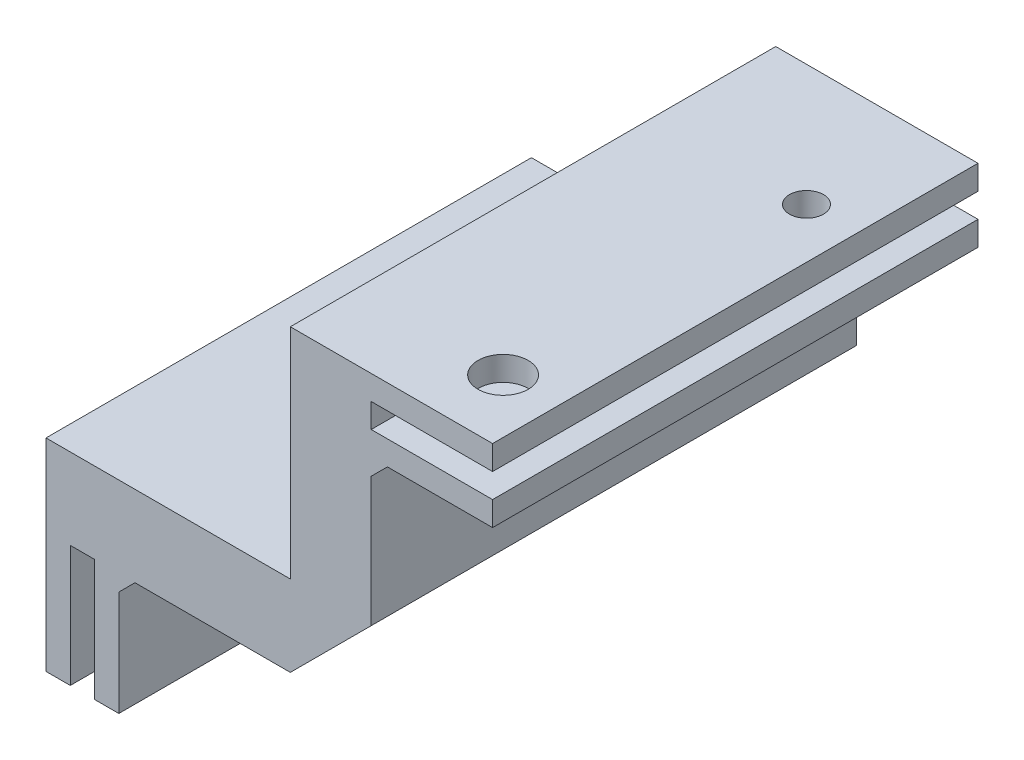
ISO-10303-21;
HEADER;
FILE_DESCRIPTION(('STEP AP214'),'2;1');
FILE_NAME('part.step','',(''),(''),'','','');
FILE_SCHEMA(('AUTOMOTIVE_DESIGN { 1 0 10303 214 1 1 1 1 }'));
ENDSEC;
DATA;
#1=APPLICATION_CONTEXT('core data for automotive mechanical design processes');
#2=APPLICATION_PROTOCOL_DEFINITION('international standard','automotive_design',2000,#1);
#3=PRODUCT_CONTEXT('',#1,'mechanical');
#4=PRODUCT('Part','Part','',(#3));
#5=PRODUCT_RELATED_PRODUCT_CATEGORY('part','',(#4));
#6=PRODUCT_DEFINITION_FORMATION('','',#4);
#7=PRODUCT_DEFINITION_CONTEXT('part definition',#1,'design');
#8=PRODUCT_DEFINITION('design','',#6,#7);
#9=PRODUCT_DEFINITION_SHAPE('','',#8);
#10=(LENGTH_UNIT() NAMED_UNIT(*) SI_UNIT(.MILLI.,.METRE.));
#11=(NAMED_UNIT(*) PLANE_ANGLE_UNIT() SI_UNIT($,.RADIAN.));
#12=(NAMED_UNIT(*) SI_UNIT($,.STERADIAN.) SOLID_ANGLE_UNIT());
#13=UNCERTAINTY_MEASURE_WITH_UNIT(LENGTH_MEASURE(1.E-05),#10,'distance_accuracy_value','');
#14=(GEOMETRIC_REPRESENTATION_CONTEXT(3) GLOBAL_UNCERTAINTY_ASSIGNED_CONTEXT((#13)) GLOBAL_UNIT_ASSIGNED_CONTEXT((#10,
#11,#12)) REPRESENTATION_CONTEXT('',''));
#15=CARTESIAN_POINT('',(0.,0.,0.));
#16=DIRECTION('',(0.,0.,1.));
#17=DIRECTION('',(1.,0.,0.));
#18=AXIS2_PLACEMENT_3D('',#15,#16,#17);
#19=CARTESIAN_POINT('',(0.,0.,60.));
#20=DIRECTION('',(1.,0.,0.));
#21=DIRECTION('',(0.,0.,-1.));
#22=AXIS2_PLACEMENT_3D('',#19,#20,#21);
#23=PLANE('',#22);
#24=CARTESIAN_POINT('',(0.,6.,15.));
#25=DIRECTION('',(1.,0.,0.));
#26=DIRECTION('',(0.,0.,-1.));
#27=AXIS2_PLACEMENT_3D('',#24,#25,#26);
#28=CIRCLE('',#27,2.1);
#29=CARTESIAN_POINT('',(0.,6.,12.9));
#30=VERTEX_POINT('',#29);
#31=EDGE_CURVE('E577',#30,#30,#28,.T.);
#32=ORIENTED_EDGE('',*,*,#31,.T.);
#33=EDGE_LOOP('',(#32));
#34=FACE_BOUND('',#33,.T.);
#35=DIRECTION('',(0.,-1.,0.));
#36=VECTOR('',#35,1.);
#37=CARTESIAN_POINT('',(0.,0.,0.));
#38=LINE('',#37,#36);
#39=CARTESIAN_POINT('',(0.,25.,0.));
#40=VERTEX_POINT('',#39);
#41=CARTESIAN_POINT('',(0.,0.,0.));
#42=VERTEX_POINT('',#41);
#43=EDGE_CURVE('E218',#40,#42,#38,.T.);
#44=ORIENTED_EDGE('',*,*,#43,.T.);
#45=DIRECTION('',(0.,0.,-1.));
#46=VECTOR('',#45,1.);
#47=CARTESIAN_POINT('',(0.,0.,60.));
#48=LINE('',#47,#46);
#49=CARTESIAN_POINT('',(0.,0.,60.));
#50=VERTEX_POINT('',#49);
#51=EDGE_CURVE('E197',#50,#42,#48,.T.);
#52=ORIENTED_EDGE('',*,*,#51,.F.);
#53=DIRECTION('',(0.,-1.,0.));
#54=VECTOR('',#53,1.);
#55=CARTESIAN_POINT('',(0.,0.,60.));
#56=LINE('',#55,#54);
#57=CARTESIAN_POINT('',(0.,25.,60.));
#58=VERTEX_POINT('',#57);
#59=EDGE_CURVE('E205',#58,#50,#56,.T.);
#60=ORIENTED_EDGE('',*,*,#59,.F.);
#61=DIRECTION('',(0.,0.,-1.));
#62=VECTOR('',#61,1.);
#63=CARTESIAN_POINT('',(0.,25.,60.));
#64=LINE('',#63,#62);
#65=EDGE_CURVE('E334',#58,#40,#64,.T.);
#66=ORIENTED_EDGE('',*,*,#65,.T.);
#67=EDGE_LOOP('',(#44,#52,#60,#66));
#68=FACE_BOUND('',#67,.T.);
#69=ADVANCED_FACE('F46',(#34,#68),#23,.F.);
#70=CARTESIAN_POINT('',(0.,0.,60.));
#71=DIRECTION('',(0.,1.,0.));
#72=DIRECTION('',(0.,0.,1.));
#73=AXIS2_PLACEMENT_3D('',#70,#71,#72);
#74=PLANE('',#73);
#75=DIRECTION('',(1.,0.,0.));
#76=VECTOR('',#75,1.);
#77=CARTESIAN_POINT('',(0.,0.,0.));
#78=LINE('',#77,#76);
#79=CARTESIAN_POINT('',(3.,0.,0.));
#80=VERTEX_POINT('',#79);
#81=EDGE_CURVE('E337',#42,#80,#78,.T.);
#82=ORIENTED_EDGE('',*,*,#81,.T.);
#83=DIRECTION('',(0.,0.,-1.));
#84=VECTOR('',#83,1.);
#85=CARTESIAN_POINT('',(3.,0.,60.));
#86=LINE('',#85,#84);
#87=CARTESIAN_POINT('',(3.,0.,60.));
#88=VERTEX_POINT('',#87);
#89=EDGE_CURVE('E200',#88,#80,#86,.T.);
#90=ORIENTED_EDGE('',*,*,#89,.F.);
#91=DIRECTION('',(1.,0.,0.));
#92=VECTOR('',#91,1.);
#93=CARTESIAN_POINT('',(0.,0.,60.));
#94=LINE('',#93,#92);
#95=EDGE_CURVE('E193',#50,#88,#94,.T.);
#96=ORIENTED_EDGE('',*,*,#95,.F.);
#97=ORIENTED_EDGE('',*,*,#51,.T.);
#98=EDGE_LOOP('',(#82,#90,#96,#97));
#99=FACE_BOUND('',#98,.T.);
#100=ADVANCED_FACE('F195',(#99),#74,.F.);
#101=CARTESIAN_POINT('',(3.,0.,60.));
#102=DIRECTION('',(-1.,0.,0.));
#103=DIRECTION('',(0.,0.,1.));
#104=AXIS2_PLACEMENT_3D('',#101,#102,#103);
#105=PLANE('',#104);
#106=CARTESIAN_POINT('',(3.,6.,15.));
#107=DIRECTION('',(-1.,0.,0.));
#108=DIRECTION('',(0.,0.,1.));
#109=AXIS2_PLACEMENT_3D('',#106,#107,#108);
#110=CIRCLE('',#109,2.1);
#111=CARTESIAN_POINT('',(3.,6.,17.1));
#112=VERTEX_POINT('',#111);
#113=EDGE_CURVE('E572',#112,#112,#110,.T.);
#114=ORIENTED_EDGE('',*,*,#113,.T.);
#115=EDGE_LOOP('',(#114));
#116=FACE_BOUND('',#115,.T.);
#117=DIRECTION('',(0.,1.,0.));
#118=VECTOR('',#117,1.);
#119=CARTESIAN_POINT('',(3.,0.,0.));
#120=LINE('',#119,#118);
#121=CARTESIAN_POINT('',(3.,15.,0.));
#122=VERTEX_POINT('',#121);
#123=EDGE_CURVE('E340',#80,#122,#120,.T.);
#124=ORIENTED_EDGE('',*,*,#123,.T.);
#125=DIRECTION('',(0.,0.,-1.));
#126=VECTOR('',#125,1.);
#127=CARTESIAN_POINT('',(3.,15.,60.));
#128=LINE('',#127,#126);
#129=CARTESIAN_POINT('',(3.,15.,60.));
#130=VERTEX_POINT('',#129);
#131=EDGE_CURVE('E227',#130,#122,#128,.T.);
#132=ORIENTED_EDGE('',*,*,#131,.F.);
#133=DIRECTION('',(0.,1.,0.));
#134=VECTOR('',#133,1.);
#135=CARTESIAN_POINT('',(3.,0.,60.));
#136=LINE('',#135,#134);
#137=EDGE_CURVE('E204',#88,#130,#136,.T.);
#138=ORIENTED_EDGE('',*,*,#137,.F.);
#139=ORIENTED_EDGE('',*,*,#89,.T.);
#140=EDGE_LOOP('',(#124,#132,#138,#139));
#141=FACE_BOUND('',#140,.T.);
#142=ADVANCED_FACE('F458',(#116,#141),#105,.F.);
#143=CARTESIAN_POINT('',(3.,15.,60.));
#144=DIRECTION('',(0.,1.,0.));
#145=DIRECTION('',(0.,0.,1.));
#146=AXIS2_PLACEMENT_3D('',#143,#144,#145);
#147=PLANE('',#146);
#148=DIRECTION('',(1.,0.,0.));
#149=VECTOR('',#148,1.);
#150=CARTESIAN_POINT('',(3.,15.,0.));
#151=LINE('',#150,#149);
#152=CARTESIAN_POINT('',(6.,15.,0.));
#153=VERTEX_POINT('',#152);
#154=EDGE_CURVE('E343',#122,#153,#151,.T.);
#155=ORIENTED_EDGE('',*,*,#154,.T.);
#156=DIRECTION('',(0.,0.,-1.));
#157=VECTOR('',#156,1.);
#158=CARTESIAN_POINT('',(6.,15.,60.));
#159=LINE('',#158,#157);
#160=CARTESIAN_POINT('',(6.,15.,60.));
#161=VERTEX_POINT('',#160);
#162=EDGE_CURVE('E432',#161,#153,#159,.T.);
#163=ORIENTED_EDGE('',*,*,#162,.F.);
#164=DIRECTION('',(1.,0.,0.));
#165=VECTOR('',#164,1.);
#166=CARTESIAN_POINT('',(3.,15.,60.));
#167=LINE('',#166,#165);
#168=EDGE_CURVE('E289',#130,#161,#167,.T.);
#169=ORIENTED_EDGE('',*,*,#168,.F.);
#170=ORIENTED_EDGE('',*,*,#131,.T.);
#171=EDGE_LOOP('',(#155,#163,#169,#170));
#172=FACE_BOUND('',#171,.T.);
#173=ADVANCED_FACE('F441',(#172),#147,.F.);
#174=CARTESIAN_POINT('',(6.,15.,60.));
#175=DIRECTION('',(1.,0.,0.));
#176=DIRECTION('',(0.,1.,0.));
#177=AXIS2_PLACEMENT_3D('',#174,#175,#176);
#178=PLANE('',#177);
#179=CARTESIAN_POINT('',(6.,6.,15.));
#180=DIRECTION('',(1.,0.,0.));
#181=DIRECTION('',(0.,1.,0.));
#182=AXIS2_PLACEMENT_3D('',#179,#180,#181);
#183=CIRCLE('',#182,2.1);
#184=CARTESIAN_POINT('',(6.,8.1,15.));
#185=VERTEX_POINT('',#184);
#186=EDGE_CURVE('E569',#185,#185,#183,.T.);
#187=ORIENTED_EDGE('',*,*,#186,.T.);
#188=EDGE_LOOP('',(#187));
#189=FACE_BOUND('',#188,.T.);
#190=DIRECTION('',(0.,-1.,0.));
#191=VECTOR('',#190,1.);
#192=CARTESIAN_POINT('',(6.,15.,0.));
#193=LINE('',#192,#191);
#194=CARTESIAN_POINT('',(6.,0.,0.));
#195=VERTEX_POINT('',#194);
#196=EDGE_CURVE('E346',#153,#195,#193,.T.);
#197=ORIENTED_EDGE('',*,*,#196,.T.);
#198=DIRECTION('',(0.,0.,-1.));
#199=VECTOR('',#198,1.);
#200=CARTESIAN_POINT('',(6.,0.,60.));
#201=LINE('',#200,#199);
#202=CARTESIAN_POINT('',(6.,0.,60.));
#203=VERTEX_POINT('',#202);
#204=EDGE_CURVE('E428',#203,#195,#201,.T.);
#205=ORIENTED_EDGE('',*,*,#204,.F.);
#206=DIRECTION('',(0.,-1.,0.));
#207=VECTOR('',#206,1.);
#208=CARTESIAN_POINT('',(6.,15.,60.));
#209=LINE('',#208,#207);
#210=EDGE_CURVE('E292',#161,#203,#209,.T.);
#211=ORIENTED_EDGE('',*,*,#210,.F.);
#212=ORIENTED_EDGE('',*,*,#162,.T.);
#213=EDGE_LOOP('',(#197,#205,#211,#212));
#214=FACE_BOUND('',#213,.T.);
#215=ADVANCED_FACE('F451',(#189,#214),#178,.F.);
#216=CARTESIAN_POINT('',(6.,0.,60.));
#217=DIRECTION('',(0.,1.,0.));
#218=DIRECTION('',(-1.,0.,0.));
#219=AXIS2_PLACEMENT_3D('',#216,#217,#218);
#220=PLANE('',#219);
#221=DIRECTION('',(1.,0.,0.));
#222=VECTOR('',#221,1.);
#223=CARTESIAN_POINT('',(6.,0.,0.));
#224=LINE('',#223,#222);
#225=CARTESIAN_POINT('',(9.,0.,0.));
#226=VERTEX_POINT('',#225);
#227=EDGE_CURVE('E349',#195,#226,#224,.T.);
#228=ORIENTED_EDGE('',*,*,#227,.T.);
#229=DIRECTION('',(0.,0.,-1.));
#230=VECTOR('',#229,1.);
#231=CARTESIAN_POINT('',(9.,0.,60.));
#232=LINE('',#231,#230);
#233=CARTESIAN_POINT('',(9.,0.,60.));
#234=VERTEX_POINT('',#233);
#235=EDGE_CURVE('E424',#234,#226,#232,.T.);
#236=ORIENTED_EDGE('',*,*,#235,.F.);
#237=DIRECTION('',(1.,0.,0.));
#238=VECTOR('',#237,1.);
#239=CARTESIAN_POINT('',(6.,0.,60.));
#240=LINE('',#239,#238);
#241=EDGE_CURVE('E295',#203,#234,#240,.T.);
#242=ORIENTED_EDGE('',*,*,#241,.F.);
#243=ORIENTED_EDGE('',*,*,#204,.T.);
#244=EDGE_LOOP('',(#228,#236,#242,#243));
#245=FACE_BOUND('',#244,.T.);
#246=ADVANCED_FACE('F455',(#245),#220,.F.);
#247=CARTESIAN_POINT('',(9.,0.,60.));
#248=DIRECTION('',(-1.,0.,0.));
#249=DIRECTION('',(0.,0.,1.));
#250=AXIS2_PLACEMENT_3D('',#247,#248,#249);
#251=PLANE('',#250);
#252=CARTESIAN_POINT('',(9.,6.,15.));
#253=DIRECTION('',(1.,0.,0.));
#254=DIRECTION('',(0.,0.,-1.));
#255=AXIS2_PLACEMENT_3D('',#252,#253,#254);
#256=CIRCLE('',#255,2.1);
#257=CARTESIAN_POINT('',(9.,6.,12.9));
#258=VERTEX_POINT('',#257);
#259=EDGE_CURVE('E573',#258,#258,#256,.T.);
#260=ORIENTED_EDGE('',*,*,#259,.F.);
#261=EDGE_LOOP('',(#260));
#262=FACE_BOUND('',#261,.T.);
#263=DIRECTION('',(0.,1.,0.));
#264=VECTOR('',#263,1.);
#265=CARTESIAN_POINT('',(9.,0.,0.));
#266=LINE('',#265,#264);
#267=CARTESIAN_POINT('',(9.,13.,0.));
#268=VERTEX_POINT('',#267);
#269=EDGE_CURVE('E352',#226,#268,#266,.T.);
#270=ORIENTED_EDGE('',*,*,#269,.T.);
#271=DIRECTION('',(0.,0.,1.));
#272=VECTOR('',#271,1.);
#273=CARTESIAN_POINT('',(9.,13.,60.));
#274=LINE('',#273,#272);
#275=CARTESIAN_POINT('',(9.,13.,60.));
#276=VERTEX_POINT('',#275);
#277=EDGE_CURVE('E65',#268,#276,#274,.T.);
#278=ORIENTED_EDGE('',*,*,#277,.T.);
#279=DIRECTION('',(0.,1.,0.));
#280=VECTOR('',#279,1.);
#281=CARTESIAN_POINT('',(9.,0.,60.));
#282=LINE('',#281,#280);
#283=EDGE_CURVE('E298',#234,#276,#282,.T.);
#284=ORIENTED_EDGE('',*,*,#283,.F.);
#285=ORIENTED_EDGE('',*,*,#235,.T.);
#286=EDGE_LOOP('',(#270,#278,#284,#285));
#287=FACE_BOUND('',#286,.T.);
#288=ADVANCED_FACE('F551',(#262,#287),#251,.F.);
#289=CARTESIAN_POINT('',(9.,15.,60.));
#290=DIRECTION('',(0.,1.,0.));
#291=DIRECTION('',(0.,0.,1.));
#292=AXIS2_PLACEMENT_3D('',#289,#290,#291);
#293=PLANE('',#292);
#294=DIRECTION('',(1.,0.,0.));
#295=VECTOR('',#294,1.);
#296=CARTESIAN_POINT('',(9.,15.,60.));
#297=LINE('',#296,#295);
#298=CARTESIAN_POINT('',(11.,15.,60.));
#299=VERTEX_POINT('',#298);
#300=CARTESIAN_POINT('',(30.1999999999999,15.,60.));
#301=VERTEX_POINT('',#300);
#302=EDGE_CURVE('E301',#299,#301,#297,.T.);
#303=ORIENTED_EDGE('',*,*,#302,.F.);
#304=DIRECTION('',(0.,0.,-1.));
#305=VECTOR('',#304,1.);
#306=CARTESIAN_POINT('',(11.,15.,0.));
#307=LINE('',#306,#305);
#308=CARTESIAN_POINT('',(11.,15.,0.));
#309=VERTEX_POINT('',#308);
#310=EDGE_CURVE('E248',#299,#309,#307,.T.);
#311=ORIENTED_EDGE('',*,*,#310,.T.);
#312=DIRECTION('',(1.,0.,0.));
#313=VECTOR('',#312,1.);
#314=CARTESIAN_POINT('',(9.,15.,0.));
#315=LINE('',#314,#313);
#316=CARTESIAN_POINT('',(30.1999999999999,15.,0.));
#317=VERTEX_POINT('',#316);
#318=EDGE_CURVE('E355',#309,#317,#315,.T.);
#319=ORIENTED_EDGE('',*,*,#318,.T.);
#320=DIRECTION('',(0.,0.,1.));
#321=VECTOR('',#320,1.);
#322=CARTESIAN_POINT('',(30.1999999999999,15.,60.));
#323=LINE('',#322,#321);
#324=EDGE_CURVE('E234',#317,#301,#323,.T.);
#325=ORIENTED_EDGE('',*,*,#324,.T.);
#326=EDGE_LOOP('',(#303,#311,#319,#325));
#327=FACE_BOUND('',#326,.T.);
#328=ADVANCED_FACE('F548',(#327),#293,.F.);
#329=CARTESIAN_POINT('',(40.2,43.,60.));
#330=DIRECTION('',(-1.,0.,0.));
#331=DIRECTION('',(0.,0.,1.));
#332=AXIS2_PLACEMENT_3D('',#329,#330,#331);
#333=PLANE('',#332);
#334=DIRECTION('',(0.,1.,0.));
#335=VECTOR('',#334,1.);
#336=CARTESIAN_POINT('',(40.2,43.,0.));
#337=LINE('',#336,#335);
#338=CARTESIAN_POINT('',(40.2,25.,0.));
#339=VERTEX_POINT('',#338);
#340=CARTESIAN_POINT('',(40.2,41.,0.));
#341=VERTEX_POINT('',#340);
#342=EDGE_CURVE('E358',#339,#341,#337,.T.);
#343=ORIENTED_EDGE('',*,*,#342,.T.);
#344=DIRECTION('',(0.,0.,1.));
#345=VECTOR('',#344,1.);
#346=CARTESIAN_POINT('',(40.2,41.,60.));
#347=LINE('',#346,#345);
#348=CARTESIAN_POINT('',(40.2,41.,60.));
#349=VERTEX_POINT('',#348);
#350=EDGE_CURVE('E245',#341,#349,#347,.T.);
#351=ORIENTED_EDGE('',*,*,#350,.T.);
#352=DIRECTION('',(0.,1.,0.));
#353=VECTOR('',#352,1.);
#354=CARTESIAN_POINT('',(40.2,43.,60.));
#355=LINE('',#354,#353);
#356=CARTESIAN_POINT('',(40.2,25.,60.));
#357=VERTEX_POINT('',#356);
#358=EDGE_CURVE('E304',#357,#349,#355,.T.);
#359=ORIENTED_EDGE('',*,*,#358,.F.);
#360=DIRECTION('',(0.,0.,-1.));
#361=VECTOR('',#360,1.);
#362=CARTESIAN_POINT('',(40.2,25.,60.));
#363=LINE('',#362,#361);
#364=EDGE_CURVE('E220',#357,#339,#363,.T.);
#365=ORIENTED_EDGE('',*,*,#364,.T.);
#366=EDGE_LOOP('',(#343,#351,#359,#365));
#367=FACE_BOUND('',#366,.T.);
#368=ADVANCED_FACE('F542',(#367),#333,.F.);
#369=CARTESIAN_POINT('',(55.2,43.,60.));
#370=DIRECTION('',(0.,1.,0.));
#371=DIRECTION('',(0.,0.,1.));
#372=AXIS2_PLACEMENT_3D('',#369,#370,#371);
#373=PLANE('',#372);
#374=CARTESIAN_POINT('',(49.,43.,15.));
#375=DIRECTION('',(0.,-1.,0.));
#376=DIRECTION('',(0.,0.,-1.));
#377=AXIS2_PLACEMENT_3D('',#374,#375,#376);
#378=CIRCLE('',#377,2.1);
#379=CARTESIAN_POINT('',(49.,43.,12.9));
#380=VERTEX_POINT('',#379);
#381=EDGE_CURVE('E584',#380,#380,#378,.T.);
#382=ORIENTED_EDGE('',*,*,#381,.F.);
#383=EDGE_LOOP('',(#382));
#384=FACE_BOUND('',#383,.T.);
#385=CARTESIAN_POINT('',(48.5,43.,52.));
#386=DIRECTION('',(0.,-1.,0.));
#387=DIRECTION('',(0.,0.,-1.));
#388=AXIS2_PLACEMENT_3D('',#385,#386,#387);
#389=CIRCLE('',#388,3.1);
#390=CARTESIAN_POINT('',(48.5,43.,48.9));
#391=VERTEX_POINT('',#390);
#392=EDGE_CURVE('E265',#391,#391,#389,.T.);
#393=ORIENTED_EDGE('',*,*,#392,.F.);
#394=EDGE_LOOP('',(#393));
#395=FACE_BOUND('',#394,.T.);
#396=DIRECTION('',(1.,0.,0.));
#397=VECTOR('',#396,1.);
#398=CARTESIAN_POINT('',(55.2,43.,60.));
#399=LINE('',#398,#397);
#400=CARTESIAN_POINT('',(42.2,43.,60.));
#401=VERTEX_POINT('',#400);
#402=CARTESIAN_POINT('',(55.2,43.,60.));
#403=VERTEX_POINT('',#402);
#404=EDGE_CURVE('E308',#401,#403,#399,.T.);
#405=ORIENTED_EDGE('',*,*,#404,.F.);
#406=DIRECTION('',(0.,0.,-1.));
#407=VECTOR('',#406,1.);
#408=CARTESIAN_POINT('',(42.2,43.,0.));
#409=LINE('',#408,#407);
#410=CARTESIAN_POINT('',(42.2,43.,0.));
#411=VERTEX_POINT('',#410);
#412=EDGE_CURVE('E241',#401,#411,#409,.T.);
#413=ORIENTED_EDGE('',*,*,#412,.T.);
#414=DIRECTION('',(1.,0.,0.));
#415=VECTOR('',#414,1.);
#416=CARTESIAN_POINT('',(55.2,43.,0.));
#417=LINE('',#416,#415);
#418=CARTESIAN_POINT('',(55.2,43.,0.));
#419=VERTEX_POINT('',#418);
#420=EDGE_CURVE('E362',#411,#419,#417,.T.);
#421=ORIENTED_EDGE('',*,*,#420,.T.);
#422=DIRECTION('',(0.,0.,-1.));
#423=VECTOR('',#422,1.);
#424=CARTESIAN_POINT('',(55.2,43.,60.));
#425=LINE('',#424,#423);
#426=EDGE_CURVE('E420',#403,#419,#425,.T.);
#427=ORIENTED_EDGE('',*,*,#426,.F.);
#428=EDGE_LOOP('',(#405,#413,#421,#427));
#429=FACE_BOUND('',#428,.T.);
#430=ADVANCED_FACE('F503',(#384,#395,#429),#373,.F.);
#431=CARTESIAN_POINT('',(55.2,46.,60.));
#432=DIRECTION('',(-1.,0.,0.));
#433=DIRECTION('',(0.,0.,1.));
#434=AXIS2_PLACEMENT_3D('',#431,#432,#433);
#435=PLANE('',#434);
#436=DIRECTION('',(0.,1.,0.));
#437=VECTOR('',#436,1.);
#438=CARTESIAN_POINT('',(55.2,46.,0.));
#439=LINE('',#438,#437);
#440=CARTESIAN_POINT('',(55.2,46.,0.));
#441=VERTEX_POINT('',#440);
#442=EDGE_CURVE('E365',#419,#441,#439,.T.);
#443=ORIENTED_EDGE('',*,*,#442,.T.);
#444=DIRECTION('',(0.,0.,-1.));
#445=VECTOR('',#444,1.);
#446=CARTESIAN_POINT('',(55.2,46.,60.));
#447=LINE('',#446,#445);
#448=CARTESIAN_POINT('',(55.2,46.,60.));
#449=VERTEX_POINT('',#448);
#450=EDGE_CURVE('E416',#449,#441,#447,.T.);
#451=ORIENTED_EDGE('',*,*,#450,.F.);
#452=DIRECTION('',(0.,1.,0.));
#453=VECTOR('',#452,1.);
#454=CARTESIAN_POINT('',(55.2,46.,60.));
#455=LINE('',#454,#453);
#456=EDGE_CURVE('E311',#403,#449,#455,.T.);
#457=ORIENTED_EDGE('',*,*,#456,.F.);
#458=ORIENTED_EDGE('',*,*,#426,.T.);
#459=EDGE_LOOP('',(#443,#451,#457,#458));
#460=FACE_BOUND('',#459,.T.);
#461=ADVANCED_FACE('F509',(#460),#435,.F.);
#462=CARTESIAN_POINT('',(40.2,46.,60.));
#463=DIRECTION('',(0.,-1.,0.));
#464=DIRECTION('',(0.,0.,-1.));
#465=AXIS2_PLACEMENT_3D('',#462,#463,#464);
#466=PLANE('',#465);
#467=CARTESIAN_POINT('',(49.,46.,15.));
#468=DIRECTION('',(0.,-1.,0.));
#469=DIRECTION('',(0.,0.,-1.));
#470=AXIS2_PLACEMENT_3D('',#467,#468,#469);
#471=CIRCLE('',#470,2.1);
#472=CARTESIAN_POINT('',(49.,46.,12.9));
#473=VERTEX_POINT('',#472);
#474=EDGE_CURVE('E274',#473,#473,#471,.T.);
#475=ORIENTED_EDGE('',*,*,#474,.T.);
#476=EDGE_LOOP('',(#475));
#477=FACE_BOUND('',#476,.T.);
#478=CARTESIAN_POINT('',(48.5,46.,52.));
#479=DIRECTION('',(0.,-1.,0.));
#480=DIRECTION('',(0.,0.,-1.));
#481=AXIS2_PLACEMENT_3D('',#478,#479,#480);
#482=CIRCLE('',#481,3.1);
#483=CARTESIAN_POINT('',(48.5,46.,48.9));
#484=VERTEX_POINT('',#483);
#485=EDGE_CURVE('E271',#484,#484,#482,.T.);
#486=ORIENTED_EDGE('',*,*,#485,.T.);
#487=EDGE_LOOP('',(#486));
#488=FACE_BOUND('',#487,.T.);
#489=DIRECTION('',(-1.,0.,0.));
#490=VECTOR('',#489,1.);
#491=CARTESIAN_POINT('',(40.2,46.,0.));
#492=LINE('',#491,#490);
#493=CARTESIAN_POINT('',(40.2,46.,0.));
#494=VERTEX_POINT('',#493);
#495=EDGE_CURVE('E368',#441,#494,#492,.T.);
#496=ORIENTED_EDGE('',*,*,#495,.T.);
#497=DIRECTION('',(0.,0.,-1.));
#498=VECTOR('',#497,1.);
#499=CARTESIAN_POINT('',(40.2,46.,60.));
#500=LINE('',#499,#498);
#501=CARTESIAN_POINT('',(40.2,46.,60.));
#502=VERTEX_POINT('',#501);
#503=EDGE_CURVE('E412',#502,#494,#500,.T.);
#504=ORIENTED_EDGE('',*,*,#503,.F.);
#505=DIRECTION('',(-1.,0.,0.));
#506=VECTOR('',#505,1.);
#507=CARTESIAN_POINT('',(40.2,46.,60.));
#508=LINE('',#507,#506);
#509=EDGE_CURVE('E314',#449,#502,#508,.T.);
#510=ORIENTED_EDGE('',*,*,#509,.F.);
#511=ORIENTED_EDGE('',*,*,#450,.T.);
#512=EDGE_LOOP('',(#496,#504,#510,#511));
#513=FACE_BOUND('',#512,.T.);
#514=ADVANCED_FACE('F515',(#477,#488,#513),#466,.F.);
#515=CARTESIAN_POINT('',(40.2,49.,60.));
#516=DIRECTION('',(-1.,0.,0.));
#517=DIRECTION('',(0.,-1.,0.));
#518=AXIS2_PLACEMENT_3D('',#515,#516,#517);
#519=PLANE('',#518);
#520=DIRECTION('',(0.,1.,0.));
#521=VECTOR('',#520,1.);
#522=CARTESIAN_POINT('',(40.2,49.,0.));
#523=LINE('',#522,#521);
#524=CARTESIAN_POINT('',(40.2,49.,0.));
#525=VERTEX_POINT('',#524);
#526=EDGE_CURVE('E371',#494,#525,#523,.T.);
#527=ORIENTED_EDGE('',*,*,#526,.T.);
#528=DIRECTION('',(0.,0.,-1.));
#529=VECTOR('',#528,1.);
#530=CARTESIAN_POINT('',(40.2,49.,60.));
#531=LINE('',#530,#529);
#532=CARTESIAN_POINT('',(40.2,49.,60.));
#533=VERTEX_POINT('',#532);
#534=EDGE_CURVE('E408',#533,#525,#531,.T.);
#535=ORIENTED_EDGE('',*,*,#534,.F.);
#536=DIRECTION('',(0.,1.,0.));
#537=VECTOR('',#536,1.);
#538=CARTESIAN_POINT('',(40.2,49.,60.));
#539=LINE('',#538,#537);
#540=EDGE_CURVE('E317',#502,#533,#539,.T.);
#541=ORIENTED_EDGE('',*,*,#540,.F.);
#542=ORIENTED_EDGE('',*,*,#503,.T.);
#543=EDGE_LOOP('',(#527,#535,#541,#542));
#544=FACE_BOUND('',#543,.T.);
#545=ADVANCED_FACE('F519',(#544),#519,.F.);
#546=CARTESIAN_POINT('',(55.2,49.,60.));
#547=DIRECTION('',(0.,1.,0.));
#548=DIRECTION('',(0.,0.,1.));
#549=AXIS2_PLACEMENT_3D('',#546,#547,#548);
#550=PLANE('',#549);
#551=CARTESIAN_POINT('',(49.,49.,15.));
#552=DIRECTION('',(0.,1.,0.));
#553=DIRECTION('',(0.,0.,1.));
#554=AXIS2_PLACEMENT_3D('',#551,#552,#553);
#555=CIRCLE('',#554,2.1);
#556=CARTESIAN_POINT('',(49.,49.,17.1));
#557=VERTEX_POINT('',#556);
#558=EDGE_CURVE('E280',#557,#557,#555,.T.);
#559=ORIENTED_EDGE('',*,*,#558,.T.);
#560=EDGE_LOOP('',(#559));
#561=FACE_BOUND('',#560,.T.);
#562=CARTESIAN_POINT('',(48.5,49.,52.));
#563=DIRECTION('',(0.,1.,0.));
#564=DIRECTION('',(0.,0.,1.));
#565=AXIS2_PLACEMENT_3D('',#562,#563,#564);
#566=CIRCLE('',#565,3.1);
#567=CARTESIAN_POINT('',(48.5,49.,55.1));
#568=VERTEX_POINT('',#567);
#569=EDGE_CURVE('E264',#568,#568,#566,.T.);
#570=ORIENTED_EDGE('',*,*,#569,.T.);
#571=EDGE_LOOP('',(#570));
#572=FACE_BOUND('',#571,.T.);
#573=DIRECTION('',(1.,0.,0.));
#574=VECTOR('',#573,1.);
#575=CARTESIAN_POINT('',(55.2,49.,0.));
#576=LINE('',#575,#574);
#577=CARTESIAN_POINT('',(55.2,49.,0.));
#578=VERTEX_POINT('',#577);
#579=EDGE_CURVE('E374',#525,#578,#576,.T.);
#580=ORIENTED_EDGE('',*,*,#579,.T.);
#581=DIRECTION('',(0.,0.,-1.));
#582=VECTOR('',#581,1.);
#583=CARTESIAN_POINT('',(55.2,49.,60.));
#584=LINE('',#583,#582);
#585=CARTESIAN_POINT('',(55.2,49.,60.));
#586=VERTEX_POINT('',#585);
#587=EDGE_CURVE('E404',#586,#578,#584,.T.);
#588=ORIENTED_EDGE('',*,*,#587,.F.);
#589=DIRECTION('',(1.,0.,0.));
#590=VECTOR('',#589,1.);
#591=CARTESIAN_POINT('',(55.2,49.,60.));
#592=LINE('',#591,#590);
#593=EDGE_CURVE('E320',#533,#586,#592,.T.);
#594=ORIENTED_EDGE('',*,*,#593,.F.);
#595=ORIENTED_EDGE('',*,*,#534,.T.);
#596=EDGE_LOOP('',(#580,#588,#594,#595));
#597=FACE_BOUND('',#596,.T.);
#598=ADVANCED_FACE('F524',(#561,#572,#597),#550,.F.);
#599=CARTESIAN_POINT('',(55.2,52.,60.));
#600=DIRECTION('',(-1.,0.,0.));
#601=DIRECTION('',(0.,0.,1.));
#602=AXIS2_PLACEMENT_3D('',#599,#600,#601);
#603=PLANE('',#602);
#604=DIRECTION('',(0.,1.,0.));
#605=VECTOR('',#604,1.);
#606=CARTESIAN_POINT('',(55.2,52.,0.));
#607=LINE('',#606,#605);
#608=CARTESIAN_POINT('',(55.2,52.,0.));
#609=VERTEX_POINT('',#608);
#610=EDGE_CURVE('E377',#578,#609,#607,.T.);
#611=ORIENTED_EDGE('',*,*,#610,.T.);
#612=DIRECTION('',(0.,0.,-1.));
#613=VECTOR('',#612,1.);
#614=CARTESIAN_POINT('',(55.2,52.,60.));
#615=LINE('',#614,#613);
#616=CARTESIAN_POINT('',(55.2,52.,60.));
#617=VERTEX_POINT('',#616);
#618=EDGE_CURVE('E400',#617,#609,#615,.T.);
#619=ORIENTED_EDGE('',*,*,#618,.F.);
#620=DIRECTION('',(0.,1.,0.));
#621=VECTOR('',#620,1.);
#622=CARTESIAN_POINT('',(55.2,52.,60.));
#623=LINE('',#622,#621);
#624=EDGE_CURVE('E323',#586,#617,#623,.T.);
#625=ORIENTED_EDGE('',*,*,#624,.F.);
#626=ORIENTED_EDGE('',*,*,#587,.T.);
#627=EDGE_LOOP('',(#611,#619,#625,#626));
#628=FACE_BOUND('',#627,.T.);
#629=ADVANCED_FACE('F530',(#628),#603,.F.);
#630=CARTESIAN_POINT('',(30.2,52.,60.));
#631=DIRECTION('',(0.,-1.,0.));
#632=DIRECTION('',(0.,0.,-1.));
#633=AXIS2_PLACEMENT_3D('',#630,#631,#632);
#634=PLANE('',#633);
#635=CARTESIAN_POINT('',(49.,52.,15.));
#636=DIRECTION('',(0.,-1.,0.));
#637=DIRECTION('',(0.,0.,-1.));
#638=AXIS2_PLACEMENT_3D('',#635,#636,#637);
#639=CIRCLE('',#638,2.1);
#640=CARTESIAN_POINT('',(49.,52.,12.9));
#641=VERTEX_POINT('',#640);
#642=EDGE_CURVE('E51',#641,#641,#639,.T.);
#643=ORIENTED_EDGE('',*,*,#642,.T.);
#644=EDGE_LOOP('',(#643));
#645=FACE_BOUND('',#644,.T.);
#646=CARTESIAN_POINT('',(48.5,52.,52.));
#647=DIRECTION('',(0.,-1.,0.));
#648=DIRECTION('',(0.,0.,-1.));
#649=AXIS2_PLACEMENT_3D('',#646,#647,#648);
#650=CIRCLE('',#649,3.1);
#651=CARTESIAN_POINT('',(48.5,52.,48.9));
#652=VERTEX_POINT('',#651);
#653=EDGE_CURVE('E261',#652,#652,#650,.T.);
#654=ORIENTED_EDGE('',*,*,#653,.T.);
#655=EDGE_LOOP('',(#654));
#656=FACE_BOUND('',#655,.T.);
#657=DIRECTION('',(-1.,0.,0.));
#658=VECTOR('',#657,1.);
#659=CARTESIAN_POINT('',(30.2,52.,0.));
#660=LINE('',#659,#658);
#661=CARTESIAN_POINT('',(30.2,52.,0.));
#662=VERTEX_POINT('',#661);
#663=EDGE_CURVE('E381',#609,#662,#660,.T.);
#664=ORIENTED_EDGE('',*,*,#663,.T.);
#665=DIRECTION('',(0.,0.,-1.));
#666=VECTOR('',#665,1.);
#667=CARTESIAN_POINT('',(30.2,52.,60.));
#668=LINE('',#667,#666);
#669=CARTESIAN_POINT('',(30.2,52.,60.));
#670=VERTEX_POINT('',#669);
#671=EDGE_CURVE('E396',#670,#662,#668,.T.);
#672=ORIENTED_EDGE('',*,*,#671,.F.);
#673=DIRECTION('',(-1.,0.,0.));
#674=VECTOR('',#673,1.);
#675=CARTESIAN_POINT('',(40.2,52.,60.));
#676=LINE('',#675,#674);
#677=EDGE_CURVE('E326',#617,#670,#676,.T.);
#678=ORIENTED_EDGE('',*,*,#677,.F.);
#679=ORIENTED_EDGE('',*,*,#618,.T.);
#680=EDGE_LOOP('',(#664,#672,#678,#679));
#681=FACE_BOUND('',#680,.T.);
#682=ADVANCED_FACE('F533',(#645,#656,#681),#634,.F.);
#683=CARTESIAN_POINT('',(30.2,25.,60.));
#684=DIRECTION('',(1.,0.,0.));
#685=DIRECTION('',(0.,0.,-1.));
#686=AXIS2_PLACEMENT_3D('',#683,#684,#685);
#687=PLANE('',#686);
#688=DIRECTION('',(0.,-1.,0.));
#689=VECTOR('',#688,1.);
#690=CARTESIAN_POINT('',(30.2,25.,0.));
#691=LINE('',#690,#689);
#692=CARTESIAN_POINT('',(30.2,25.,0.));
#693=VERTEX_POINT('',#692);
#694=EDGE_CURVE('E384',#662,#693,#691,.T.);
#695=ORIENTED_EDGE('',*,*,#694,.T.);
#696=DIRECTION('',(0.,0.,-1.));
#697=VECTOR('',#696,1.);
#698=CARTESIAN_POINT('',(30.2,25.,60.));
#699=LINE('',#698,#697);
#700=CARTESIAN_POINT('',(30.2,25.,60.));
#701=VERTEX_POINT('',#700);
#702=EDGE_CURVE('E392',#701,#693,#699,.T.);
#703=ORIENTED_EDGE('',*,*,#702,.F.);
#704=DIRECTION('',(0.,-1.,0.));
#705=VECTOR('',#704,1.);
#706=CARTESIAN_POINT('',(30.2,25.,60.));
#707=LINE('',#706,#705);
#708=EDGE_CURVE('E329',#670,#701,#707,.T.);
#709=ORIENTED_EDGE('',*,*,#708,.F.);
#710=ORIENTED_EDGE('',*,*,#671,.T.);
#711=EDGE_LOOP('',(#695,#703,#709,#710));
#712=FACE_BOUND('',#711,.T.);
#713=ADVANCED_FACE('F538',(#712),#687,.F.);
#714=CARTESIAN_POINT('',(0.,25.,60.));
#715=DIRECTION('',(0.,-1.,0.));
#716=DIRECTION('',(0.,0.,-1.));
#717=AXIS2_PLACEMENT_3D('',#714,#715,#716);
#718=PLANE('',#717);
#719=DIRECTION('',(-1.,0.,0.));
#720=VECTOR('',#719,1.);
#721=CARTESIAN_POINT('',(0.,25.,0.));
#722=LINE('',#721,#720);
#723=EDGE_CURVE('E215',#693,#40,#722,.T.);
#724=ORIENTED_EDGE('',*,*,#723,.T.);
#725=ORIENTED_EDGE('',*,*,#65,.F.);
#726=DIRECTION('',(-1.,0.,0.));
#727=VECTOR('',#726,1.);
#728=CARTESIAN_POINT('',(9.,25.,60.));
#729=LINE('',#728,#727);
#730=EDGE_CURVE('E210',#701,#58,#729,.T.);
#731=ORIENTED_EDGE('',*,*,#730,.F.);
#732=ORIENTED_EDGE('',*,*,#702,.T.);
#733=EDGE_LOOP('',(#724,#725,#731,#732));
#734=FACE_BOUND('',#733,.T.);
#735=ADVANCED_FACE('F540',(#734),#718,.F.);
#736=CARTESIAN_POINT('',(0.,0.,60.));
#737=DIRECTION('',(0.,0.,-1.));
#738=DIRECTION('',(-1.,0.,0.));
#739=AXIS2_PLACEMENT_3D('',#736,#737,#738);
#740=PLANE('',#739);
#741=ORIENTED_EDGE('',*,*,#283,.T.);
#742=DIRECTION('',(-0.70710678118655,-0.707106781186545,0.));
#743=VECTOR('',#742,1.);
#744=CARTESIAN_POINT('',(-2.00000000000004,2.00000000000005,60.));
#745=LINE('',#744,#743);
#746=EDGE_CURVE('E11',#276,#299,#745,.F.);
#747=ORIENTED_EDGE('',*,*,#746,.T.);
#748=ORIENTED_EDGE('',*,*,#302,.T.);
#749=DIRECTION('',(-0.707106781186549,-0.707106781186546,0.));
#750=VECTOR('',#749,1.);
#751=CARTESIAN_POINT('',(40.2,25.,60.));
#752=LINE('',#751,#750);
#753=EDGE_CURVE('E238',#301,#357,#752,.F.);
#754=ORIENTED_EDGE('',*,*,#753,.T.);
#755=ORIENTED_EDGE('',*,*,#358,.T.);
#756=DIRECTION('',(-0.70710678118655,-0.707106781186545,0.));
#757=VECTOR('',#756,1.);
#758=CARTESIAN_POINT('',(-0.400000000000141,0.400000000000144,60.));
#759=LINE('',#758,#757);
#760=EDGE_CURVE('E257',#349,#401,#759,.F.);
#761=ORIENTED_EDGE('',*,*,#760,.T.);
#762=ORIENTED_EDGE('',*,*,#404,.T.);
#763=ORIENTED_EDGE('',*,*,#456,.T.);
#764=ORIENTED_EDGE('',*,*,#509,.T.);
#765=ORIENTED_EDGE('',*,*,#540,.T.);
#766=ORIENTED_EDGE('',*,*,#593,.T.);
#767=ORIENTED_EDGE('',*,*,#624,.T.);
#768=ORIENTED_EDGE('',*,*,#677,.T.);
#769=ORIENTED_EDGE('',*,*,#708,.T.);
#770=ORIENTED_EDGE('',*,*,#730,.T.);
#771=ORIENTED_EDGE('',*,*,#59,.T.);
#772=ORIENTED_EDGE('',*,*,#95,.T.);
#773=ORIENTED_EDGE('',*,*,#137,.T.);
#774=ORIENTED_EDGE('',*,*,#168,.T.);
#775=ORIENTED_EDGE('',*,*,#210,.T.);
#776=ORIENTED_EDGE('',*,*,#241,.T.);
#777=EDGE_LOOP('',(#741,#747,#748,#754,#755,#761,#762,#763,#764,#765,#766,#767,#768,#769,#770,
#771,#772,#773,#774,#775,#776));
#778=FACE_BOUND('',#777,.T.);
#779=ADVANCED_FACE('F208',(#778),#740,.F.);
#780=CARTESIAN_POINT('',(0.,0.,0.));
#781=DIRECTION('',(0.,0.,-1.));
#782=DIRECTION('',(-1.,0.,0.));
#783=AXIS2_PLACEMENT_3D('',#780,#781,#782);
#784=PLANE('',#783);
#785=ORIENTED_EDGE('',*,*,#342,.F.);
#786=DIRECTION('',(0.707106781186549,0.707106781186546,0.));
#787=VECTOR('',#786,1.);
#788=CARTESIAN_POINT('',(7.59999999999991,-7.59999999999994,0.));
#789=LINE('',#788,#787);
#790=EDGE_CURVE('E225',#339,#317,#789,.F.);
#791=ORIENTED_EDGE('',*,*,#790,.T.);
#792=ORIENTED_EDGE('',*,*,#318,.F.);
#793=DIRECTION('',(0.70710678118655,0.707106781186545,0.));
#794=VECTOR('',#793,1.);
#795=CARTESIAN_POINT('',(11.,15.,0.));
#796=LINE('',#795,#794);
#797=EDGE_CURVE('E57',#309,#268,#796,.F.);
#798=ORIENTED_EDGE('',*,*,#797,.T.);
#799=ORIENTED_EDGE('',*,*,#269,.F.);
#800=ORIENTED_EDGE('',*,*,#227,.F.);
#801=ORIENTED_EDGE('',*,*,#196,.F.);
#802=ORIENTED_EDGE('',*,*,#154,.F.);
#803=ORIENTED_EDGE('',*,*,#123,.F.);
#804=ORIENTED_EDGE('',*,*,#81,.F.);
#805=ORIENTED_EDGE('',*,*,#43,.F.);
#806=ORIENTED_EDGE('',*,*,#723,.F.);
#807=ORIENTED_EDGE('',*,*,#694,.F.);
#808=ORIENTED_EDGE('',*,*,#663,.F.);
#809=ORIENTED_EDGE('',*,*,#610,.F.);
#810=ORIENTED_EDGE('',*,*,#579,.F.);
#811=ORIENTED_EDGE('',*,*,#526,.F.);
#812=ORIENTED_EDGE('',*,*,#495,.F.);
#813=ORIENTED_EDGE('',*,*,#442,.F.);
#814=ORIENTED_EDGE('',*,*,#420,.F.);
#815=DIRECTION('',(0.70710678118655,0.707106781186545,0.));
#816=VECTOR('',#815,1.);
#817=CARTESIAN_POINT('',(42.2,43.,0.));
#818=LINE('',#817,#816);
#819=EDGE_CURVE('E254',#411,#341,#818,.F.);
#820=ORIENTED_EDGE('',*,*,#819,.T.);
#821=EDGE_LOOP('',(#785,#791,#792,#798,#799,#800,#801,#802,#803,#804,#805,#806,#807,#808,#809,
#810,#811,#812,#813,#814,#820));
#822=FACE_BOUND('',#821,.T.);
#823=ADVANCED_FACE('F447',(#822),#784,.T.);
#824=CARTESIAN_POINT('',(40.2,25.,60.));
#825=DIRECTION('',(-0.707106781186546,0.707106781186549,0.));
#826=DIRECTION('',(0.,0.,-1.));
#827=AXIS2_PLACEMENT_3D('',#824,#825,#826);
#828=PLANE('',#827);
#829=ORIENTED_EDGE('',*,*,#753,.F.);
#830=ORIENTED_EDGE('',*,*,#324,.F.);
#831=ORIENTED_EDGE('',*,*,#790,.F.);
#832=ORIENTED_EDGE('',*,*,#364,.F.);
#833=EDGE_LOOP('',(#829,#830,#831,#832));
#834=FACE_BOUND('',#833,.T.);
#835=ADVANCED_FACE('F479',(#834),#828,.F.);
#836=CARTESIAN_POINT('',(42.2,43.,60.));
#837=DIRECTION('',(0.707106781186545,-0.70710678118655,0.));
#838=DIRECTION('',(0.,0.,1.));
#839=AXIS2_PLACEMENT_3D('',#836,#837,#838);
#840=PLANE('',#839);
#841=ORIENTED_EDGE('',*,*,#760,.F.);
#842=ORIENTED_EDGE('',*,*,#350,.F.);
#843=ORIENTED_EDGE('',*,*,#819,.F.);
#844=ORIENTED_EDGE('',*,*,#412,.F.);
#845=EDGE_LOOP('',(#841,#842,#843,#844));
#846=FACE_BOUND('',#845,.T.);
#847=ADVANCED_FACE('F484',(#846),#840,.T.);
#848=CARTESIAN_POINT('',(11.,15.,60.));
#849=DIRECTION('',(0.707106781186545,-0.70710678118655,0.));
#850=DIRECTION('',(0.,0.,1.));
#851=AXIS2_PLACEMENT_3D('',#848,#849,#850);
#852=PLANE('',#851);
#853=ORIENTED_EDGE('',*,*,#746,.F.);
#854=ORIENTED_EDGE('',*,*,#277,.F.);
#855=ORIENTED_EDGE('',*,*,#797,.F.);
#856=ORIENTED_EDGE('',*,*,#310,.F.);
#857=EDGE_LOOP('',(#853,#854,#855,#856));
#858=FACE_BOUND('',#857,.T.);
#859=ADVANCED_FACE('F49',(#858),#852,.T.);
#860=CARTESIAN_POINT('',(48.5,53.,52.));
#861=DIRECTION('',(0.,-1.,0.));
#862=DIRECTION('',(0.,0.,-1.));
#863=AXIS2_PLACEMENT_3D('',#860,#861,#862);
#864=CYLINDRICAL_SURFACE('',#863,3.1);
#865=ORIENTED_EDGE('',*,*,#653,.F.);
#866=EDGE_LOOP('',(#865));
#867=FACE_BOUND('',#866,.T.);
#868=ORIENTED_EDGE('',*,*,#569,.F.);
#869=EDGE_LOOP('',(#868));
#870=FACE_BOUND('',#869,.T.);
#871=ADVANCED_FACE('F494',(#867,#870),#864,.F.);
#872=ORIENTED_EDGE('',*,*,#392,.T.);
#873=EDGE_LOOP('',(#872));
#874=FACE_BOUND('',#873,.T.);
#875=ORIENTED_EDGE('',*,*,#485,.F.);
#876=EDGE_LOOP('',(#875));
#877=FACE_BOUND('',#876,.T.);
#878=ADVANCED_FACE('F600',(#874,#877),#864,.F.);
#879=CARTESIAN_POINT('',(49.,53.,15.));
#880=DIRECTION('',(0.,-1.,0.));
#881=DIRECTION('',(0.,0.,-1.));
#882=AXIS2_PLACEMENT_3D('',#879,#880,#881);
#883=CYLINDRICAL_SURFACE('',#882,2.1);
#884=ORIENTED_EDGE('',*,*,#642,.F.);
#885=EDGE_LOOP('',(#884));
#886=FACE_BOUND('',#885,.T.);
#887=ORIENTED_EDGE('',*,*,#558,.F.);
#888=EDGE_LOOP('',(#887));
#889=FACE_BOUND('',#888,.T.);
#890=ADVANCED_FACE('F596',(#886,#889),#883,.F.);
#891=ORIENTED_EDGE('',*,*,#381,.T.);
#892=EDGE_LOOP('',(#891));
#893=FACE_BOUND('',#892,.T.);
#894=ORIENTED_EDGE('',*,*,#474,.F.);
#895=EDGE_LOOP('',(#894));
#896=FACE_BOUND('',#895,.T.);
#897=ADVANCED_FACE('F599',(#893,#896),#883,.F.);
#898=CARTESIAN_POINT('',(-0.999999999999999,6.,15.));
#899=DIRECTION('',(1.,0.,0.));
#900=DIRECTION('',(0.,0.,-1.));
#901=AXIS2_PLACEMENT_3D('',#898,#899,#900);
#902=CYLINDRICAL_SURFACE('',#901,2.1);
#903=ORIENTED_EDGE('',*,*,#259,.T.);
#904=EDGE_LOOP('',(#903));
#905=FACE_BOUND('',#904,.T.);
#906=ORIENTED_EDGE('',*,*,#186,.F.);
#907=EDGE_LOOP('',(#906));
#908=FACE_BOUND('',#907,.T.);
#909=ADVANCED_FACE('F605',(#905,#908),#902,.F.);
#910=ORIENTED_EDGE('',*,*,#113,.F.);
#911=EDGE_LOOP('',(#910));
#912=FACE_BOUND('',#911,.T.);
#913=ORIENTED_EDGE('',*,*,#31,.F.);
#914=EDGE_LOOP('',(#913));
#915=FACE_BOUND('',#914,.T.);
#916=ADVANCED_FACE('F610',(#912,#915),#902,.F.);
#917=CLOSED_SHELL('',(#69,#100,#142,#173,#215,#246,#288,#328,#368,#430,#461,#514,#545,#598,#629,
#682,#713,#735,#779,#823,#835,#847,#859,#871,#878,#890,#897,#909,#916));
#918=MANIFOLD_SOLID_BREP('B2',#917);
#919=ADVANCED_BREP_SHAPE_REPRESENTATION('',(#18,#918),#14);
#920=SHAPE_DEFINITION_REPRESENTATION(#9,#919);
ENDSEC;
END-ISO-10303-21;
